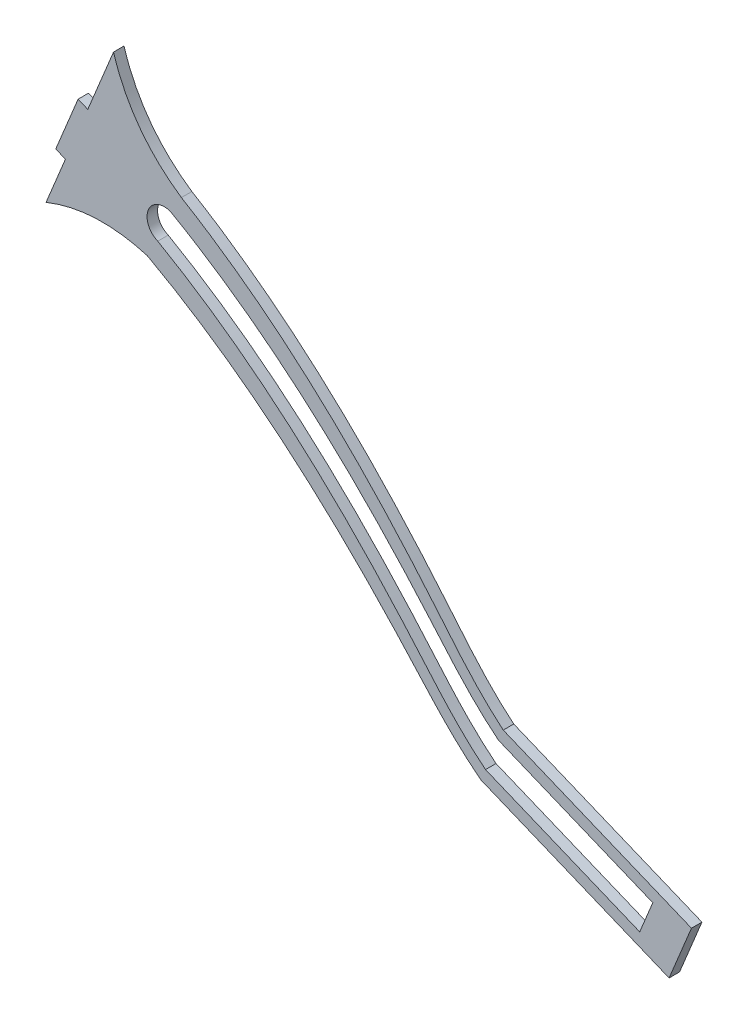
ISO-10303-21;
HEADER;
FILE_DESCRIPTION(('STEP AP214'),'2;1');
FILE_NAME('part.step','',(''),(''),'','','');
FILE_SCHEMA(('AUTOMOTIVE_DESIGN { 1 0 10303 214 1 1 1 1 }'));
ENDSEC;
DATA;
#1=APPLICATION_CONTEXT('core data for automotive mechanical design processes');
#2=APPLICATION_PROTOCOL_DEFINITION('international standard','automotive_design',2000,#1);
#3=PRODUCT_CONTEXT('',#1,'mechanical');
#4=PRODUCT('Part','Part','',(#3));
#5=PRODUCT_RELATED_PRODUCT_CATEGORY('part','',(#4));
#6=PRODUCT_DEFINITION_FORMATION('','',#4);
#7=PRODUCT_DEFINITION_CONTEXT('part definition',#1,'design');
#8=PRODUCT_DEFINITION('design','',#6,#7);
#9=PRODUCT_DEFINITION_SHAPE('','',#8);
#10=(LENGTH_UNIT() NAMED_UNIT(*) SI_UNIT(.MILLI.,.METRE.));
#11=(NAMED_UNIT(*) PLANE_ANGLE_UNIT() SI_UNIT($,.RADIAN.));
#12=(NAMED_UNIT(*) SI_UNIT($,.STERADIAN.) SOLID_ANGLE_UNIT());
#13=UNCERTAINTY_MEASURE_WITH_UNIT(LENGTH_MEASURE(1.E-05),#10,'distance_accuracy_value','');
#14=(GEOMETRIC_REPRESENTATION_CONTEXT(3) GLOBAL_UNCERTAINTY_ASSIGNED_CONTEXT((#13)) GLOBAL_UNIT_ASSIGNED_CONTEXT((#10,
#11,#12)) REPRESENTATION_CONTEXT('',''));
#15=CARTESIAN_POINT('',(0.,0.,0.));
#16=DIRECTION('',(0.,0.,1.));
#17=DIRECTION('',(1.,0.,0.));
#18=AXIS2_PLACEMENT_3D('',#15,#16,#17);
#19=CARTESIAN_POINT('',(72.8165035843439,-45.1124411842966,319.609115736228));
#20=DIRECTION('',(0.924724873269552,-0.380636189499385,0.));
#21=DIRECTION('',(0.380636189499385,0.924724873269552,0.));
#22=AXIS2_PLACEMENT_3D('',#19,#20,#21);
#23=PLANE('',#22);
#24=DIRECTION('',(0.380636189499385,0.924724873269552,0.));
#25=VECTOR('',#24,1.);
#26=CARTESIAN_POINT('',(72.8165035843439,-45.1124411842966,324.609115736228));
#27=LINE('',#26,#25);
#28=CARTESIAN_POINT('',(72.8165035843439,-45.1124411842966,324.609115736228));
#29=VERTEX_POINT('',#28);
#30=CARTESIAN_POINT('',(83.4743168902917,-19.2201447328341,324.609115736228));
#31=VERTEX_POINT('',#30);
#32=EDGE_CURVE('E244',#29,#31,#27,.T.);
#33=ORIENTED_EDGE('',*,*,#32,.F.);
#34=DIRECTION('',(0.,0.,1.));
#35=VECTOR('',#34,1.);
#36=CARTESIAN_POINT('',(72.8165035843439,-45.1124411842966,319.609115736228));
#37=LINE('',#36,#35);
#38=CARTESIAN_POINT('',(72.8165035843439,-45.1124411842966,319.609115736228));
#39=VERTEX_POINT('',#38);
#40=EDGE_CURVE('E11',#39,#29,#37,.T.);
#41=ORIENTED_EDGE('',*,*,#40,.F.);
#42=DIRECTION('',(0.380636189499385,0.924724873269552,0.));
#43=VECTOR('',#42,1.);
#44=CARTESIAN_POINT('',(72.8165035843439,-45.1124411842966,319.609115736228));
#45=LINE('',#44,#43);
#46=CARTESIAN_POINT('',(83.4743168902917,-19.2201447328341,319.609115736228));
#47=VERTEX_POINT('',#46);
#48=EDGE_CURVE('E300',#39,#47,#45,.T.);
#49=ORIENTED_EDGE('',*,*,#48,.T.);
#50=DIRECTION('',(0.,0.,1.));
#51=VECTOR('',#50,1.);
#52=CARTESIAN_POINT('',(83.4743168902917,-19.2201447328341,319.609115736228));
#53=LINE('',#52,#51);
#54=EDGE_CURVE('E40',#47,#31,#53,.T.);
#55=ORIENTED_EDGE('',*,*,#54,.T.);
#56=EDGE_LOOP('',(#33,#41,#49,#55));
#57=FACE_BOUND('',#56,.T.);
#58=ADVANCED_FACE('F37',(#57),#23,.T.);
#59=CARTESIAN_POINT('',(-16.9001284398286,-8.18319018701635,319.609115736228));
#60=DIRECTION('',(-0.380636189499384,-0.924724873269552,0.));
#61=DIRECTION('',(0.924724873269552,-0.380636189499384,0.));
#62=AXIS2_PLACEMENT_3D('',#59,#60,#61);
#63=PLANE('',#62);
#64=DIRECTION('',(0.924724873269552,-0.380636189499384,0.));
#65=VECTOR('',#64,1.);
#66=CARTESIAN_POINT('',(-16.9001284398286,-8.18319018701635,324.609115736228));
#67=LINE('',#66,#65);
#68=CARTESIAN_POINT('',(-16.9001284398286,-8.18319018701635,324.609115736228));
#69=VERTEX_POINT('',#68);
#70=EDGE_CURVE('E295',#69,#29,#67,.T.);
#71=ORIENTED_EDGE('',*,*,#70,.F.);
#72=DIRECTION('',(0.,0.,1.));
#73=VECTOR('',#72,1.);
#74=CARTESIAN_POINT('',(-16.9001284398286,-8.18319018701635,319.609115736228));
#75=LINE('',#74,#73);
#76=CARTESIAN_POINT('',(-16.9001284398286,-8.18319018701635,319.609115736228));
#77=VERTEX_POINT('',#76);
#78=EDGE_CURVE('E45',#77,#69,#75,.T.);
#79=ORIENTED_EDGE('',*,*,#78,.F.);
#80=DIRECTION('',(0.924724873269552,-0.380636189499384,0.));
#81=VECTOR('',#80,1.);
#82=CARTESIAN_POINT('',(-16.9001284398286,-8.18319018701635,319.609115736228));
#83=LINE('',#82,#81);
#84=EDGE_CURVE('E233',#77,#39,#83,.T.);
#85=ORIENTED_EDGE('',*,*,#84,.T.);
#86=ORIENTED_EDGE('',*,*,#40,.T.);
#87=EDGE_LOOP('',(#71,#79,#85,#86));
#88=FACE_BOUND('',#87,.T.);
#89=ADVANCED_FACE('F215',(#88),#63,.T.);
#90=CARTESIAN_POINT('',(-175.911850272844,128.697068334976,319.609115736228));
#91=CARTESIAN_POINT('',(-128.517955825498,102.867060046128,319.609115736228));
#92=CARTESIAN_POINT('',(-75.8520297238891,55.4312582830564,319.609115736228));
#93=CARTESIAN_POINT('',(-30.2221925070742,2.01197393009321,319.609115736228));
#94=CARTESIAN_POINT('',(-16.9001284398227,-8.18319018700178,319.609115736228));
#95=B_SPLINE_CURVE_WITH_KNOTS('',3,(#90,#91,#92,#93,#94),.UNSPECIFIED.,.F.,.F.,(4,1,4),(0.,
0.762851527431731,1.),.UNSPECIFIED.);
#96=DIRECTION('',(0.,0.,1.));
#97=VECTOR('',#96,1.);
#98=SURFACE_OF_LINEAR_EXTRUSION('',#95,#97);
#99=CARTESIAN_POINT('',(-175.911850272844,128.697068334976,324.609115736228));
#100=CARTESIAN_POINT('',(-128.517955825498,102.867060046128,324.609115736228));
#101=CARTESIAN_POINT('',(-75.8520297238891,55.4312582830564,324.609115736228));
#102=CARTESIAN_POINT('',(-30.2221925070742,2.01197393009321,324.609115736228));
#103=CARTESIAN_POINT('',(-16.9001284398227,-8.18319018700178,324.609115736228));
#104=B_SPLINE_CURVE_WITH_KNOTS('',3,(#99,#100,#101,#102,#103),.UNSPECIFIED.,.F.,.F.,(4,1,4),(0.,
0.762851527431731,1.),.UNSPECIFIED.);
#105=CARTESIAN_POINT('',(-175.911850272844,128.697068334976,324.609115736228));
#106=VERTEX_POINT('',#105);
#107=EDGE_CURVE('E287',#106,#69,#104,.T.);
#108=ORIENTED_EDGE('',*,*,#107,.F.);
#109=DIRECTION('',(0.,0.,1.));
#110=VECTOR('',#109,1.);
#111=CARTESIAN_POINT('',(-175.911850272844,128.697068334976,319.609115736228));
#112=LINE('',#111,#110);
#113=CARTESIAN_POINT('',(-175.911850272844,128.697068334976,319.609115736228));
#114=VERTEX_POINT('',#113);
#115=EDGE_CURVE('E303',#114,#106,#112,.T.);
#116=ORIENTED_EDGE('',*,*,#115,.F.);
#117=EDGE_CURVE('E227',#114,#77,#95,.T.);
#118=ORIENTED_EDGE('',*,*,#117,.T.);
#119=ORIENTED_EDGE('',*,*,#78,.T.);
#120=EDGE_LOOP('',(#108,#116,#118,#119));
#121=FACE_BOUND('',#120,.T.);
#122=ADVANCED_FACE('F218',(#121),#98,.T.);
#123=CARTESIAN_POINT('',(-224.182907520058,126.592874832316,319.609115736228));
#124=CARTESIAN_POINT('',(-200.797987468874,136.066038880565,319.609115736228));
#125=CARTESIAN_POINT('',(-175.911850272844,128.697068334976,319.609115736228));
#126=B_SPLINE_CURVE_WITH_KNOTS('',2,(#123,#124,#125),.UNSPECIFIED.,.F.,.F.,(3,3),(0.,1.),.UNSPECIFIED.);
#127=DIRECTION('',(0.,0.,1.));
#128=VECTOR('',#127,1.);
#129=SURFACE_OF_LINEAR_EXTRUSION('',#126,#128);
#130=CARTESIAN_POINT('',(-224.182907520058,126.592874832316,324.609115736228));
#131=CARTESIAN_POINT('',(-200.797987468874,136.066038880565,324.609115736228));
#132=CARTESIAN_POINT('',(-175.911850272844,128.697068334976,324.609115736228));
#133=B_SPLINE_CURVE_WITH_KNOTS('',2,(#130,#131,#132),.UNSPECIFIED.,.F.,.F.,(3,3),(0.,1.),.UNSPECIFIED.);
#134=CARTESIAN_POINT('',(-224.182907520058,126.592874832316,324.609115736228));
#135=VERTEX_POINT('',#134);
#136=EDGE_CURVE('E282',#135,#106,#133,.T.);
#137=ORIENTED_EDGE('',*,*,#136,.F.);
#138=DIRECTION('',(0.,0.,1.));
#139=VECTOR('',#138,1.);
#140=CARTESIAN_POINT('',(-224.182907520058,126.592874832316,319.609115736228));
#141=LINE('',#140,#139);
#142=CARTESIAN_POINT('',(-224.182907520058,126.592874832316,319.609115736228));
#143=VERTEX_POINT('',#142);
#144=EDGE_CURVE('E305',#143,#135,#141,.T.);
#145=ORIENTED_EDGE('',*,*,#144,.F.);
#146=EDGE_CURVE('E234',#143,#114,#126,.T.);
#147=ORIENTED_EDGE('',*,*,#146,.T.);
#148=ORIENTED_EDGE('',*,*,#115,.T.);
#149=EDGE_LOOP('',(#137,#145,#147,#148));
#150=FACE_BOUND('',#149,.T.);
#151=ADVANCED_FACE('F223',(#150),#129,.T.);
#152=CARTESIAN_POINT('',(-224.182907520058,126.592874832316,319.609115736228));
#153=DIRECTION('',(-0.924724873269552,0.380636189499385,0.));
#154=DIRECTION('',(-0.380636189499385,-0.924724873269552,0.));
#155=AXIS2_PLACEMENT_3D('',#152,#153,#154);
#156=PLANE('',#155);
#157=DIRECTION('',(-0.380636189499385,-0.924724873269552,0.));
#158=VECTOR('',#157,1.);
#159=CARTESIAN_POINT('',(-224.182907520058,126.592874832316,324.609115736228));
#160=LINE('',#159,#158);
#161=CARTESIAN_POINT('',(-214.945420062279,149.034604374529,324.609115736228));
#162=VERTEX_POINT('',#161);
#163=EDGE_CURVE('E279',#162,#135,#160,.T.);
#164=ORIENTED_EDGE('',*,*,#163,.F.);
#165=DIRECTION('',(0.,0.,1.));
#166=VECTOR('',#165,1.);
#167=CARTESIAN_POINT('',(-214.945420062279,149.034604374529,319.609115736228));
#168=LINE('',#167,#166);
#169=CARTESIAN_POINT('',(-214.945420062279,149.034604374529,319.609115736228));
#170=VERTEX_POINT('',#169);
#171=EDGE_CURVE('E307',#170,#162,#168,.T.);
#172=ORIENTED_EDGE('',*,*,#171,.F.);
#173=DIRECTION('',(-0.380636189499385,-0.924724873269552,0.));
#174=VECTOR('',#173,1.);
#175=CARTESIAN_POINT('',(-224.182907520058,126.592874832316,319.609115736228));
#176=LINE('',#175,#174);
#177=EDGE_CURVE('E612',#170,#143,#176,.T.);
#178=ORIENTED_EDGE('',*,*,#177,.T.);
#179=ORIENTED_EDGE('',*,*,#144,.T.);
#180=EDGE_LOOP('',(#164,#172,#178,#179));
#181=FACE_BOUND('',#180,.T.);
#182=ADVANCED_FACE('F380',(#181),#156,.T.);
#183=CARTESIAN_POINT('',(-219.569044428627,150.937785322026,319.609115736228));
#184=DIRECTION('',(-0.380636189499384,-0.924724873269552,0.));
#185=DIRECTION('',(0.924724873269552,-0.380636189499384,0.));
#186=AXIS2_PLACEMENT_3D('',#183,#184,#185);
#187=PLANE('',#186);
#188=DIRECTION('',(0.924724873269552,-0.380636189499384,0.));
#189=VECTOR('',#188,1.);
#190=CARTESIAN_POINT('',(-219.569044428627,150.937785322026,324.609115736228));
#191=LINE('',#190,#189);
#192=CARTESIAN_POINT('',(-219.569044428627,150.937785322026,324.609115736228));
#193=VERTEX_POINT('',#192);
#194=EDGE_CURVE('E276',#193,#162,#191,.T.);
#195=ORIENTED_EDGE('',*,*,#194,.F.);
#196=DIRECTION('',(0.,0.,1.));
#197=VECTOR('',#196,1.);
#198=CARTESIAN_POINT('',(-219.569044428627,150.937785322026,319.609115736228));
#199=LINE('',#198,#197);
#200=CARTESIAN_POINT('',(-219.569044428627,150.937785322026,319.609115736228));
#201=VERTEX_POINT('',#200);
#202=EDGE_CURVE('E309',#201,#193,#199,.T.);
#203=ORIENTED_EDGE('',*,*,#202,.F.);
#204=DIRECTION('',(0.924724873269552,-0.380636189499384,0.));
#205=VECTOR('',#204,1.);
#206=CARTESIAN_POINT('',(-219.569044428627,150.937785322026,319.609115736228));
#207=LINE('',#206,#205);
#208=EDGE_CURVE('E610',#201,#170,#207,.T.);
#209=ORIENTED_EDGE('',*,*,#208,.T.);
#210=ORIENTED_EDGE('',*,*,#171,.T.);
#211=EDGE_LOOP('',(#195,#203,#209,#210));
#212=FACE_BOUND('',#211,.T.);
#213=ADVANCED_FACE('F387',(#212),#187,.T.);
#214=CARTESIAN_POINT('',(-219.569044428627,150.937785322026,319.609115736228));
#215=DIRECTION('',(-0.924724873269552,0.380636189499385,0.));
#216=DIRECTION('',(-0.380636189499385,-0.924724873269552,0.));
#217=AXIS2_PLACEMENT_3D('',#214,#215,#216);
#218=PLANE('',#217);
#219=DIRECTION('',(-0.380636189499385,-0.924724873269552,0.));
#220=VECTOR('',#219,1.);
#221=CARTESIAN_POINT('',(-219.569044428627,150.937785322026,324.609115736228));
#222=LINE('',#221,#220);
#223=CARTESIAN_POINT('',(-208.911231122383,176.830081774207,324.609115736228));
#224=VERTEX_POINT('',#223);
#225=EDGE_CURVE('E273',#224,#193,#222,.T.);
#226=ORIENTED_EDGE('',*,*,#225,.F.);
#227=DIRECTION('',(0.,0.,1.));
#228=VECTOR('',#227,1.);
#229=CARTESIAN_POINT('',(-208.911231122383,176.830081774207,319.609115736228));
#230=LINE('',#229,#228);
#231=CARTESIAN_POINT('',(-208.911231122383,176.830081774207,319.609115736228));
#232=VERTEX_POINT('',#231);
#233=EDGE_CURVE('E311',#232,#224,#230,.T.);
#234=ORIENTED_EDGE('',*,*,#233,.F.);
#235=DIRECTION('',(-0.380636189499385,-0.924724873269552,0.));
#236=VECTOR('',#235,1.);
#237=CARTESIAN_POINT('',(-219.569044428627,150.937785322026,319.609115736228));
#238=LINE('',#237,#236);
#239=EDGE_CURVE('E605',#232,#201,#238,.T.);
#240=ORIENTED_EDGE('',*,*,#239,.T.);
#241=ORIENTED_EDGE('',*,*,#202,.T.);
#242=EDGE_LOOP('',(#226,#234,#240,#241));
#243=FACE_BOUND('',#242,.T.);
#244=ADVANCED_FACE('F394',(#243),#218,.T.);
#245=CARTESIAN_POINT('',(-208.911231122383,176.830081774207,319.609115736228));
#246=DIRECTION('',(0.380636189499384,0.924724873269552,0.));
#247=DIRECTION('',(-0.924724873269552,0.380636189499384,0.));
#248=AXIS2_PLACEMENT_3D('',#245,#246,#247);
#249=PLANE('',#248);
#250=DIRECTION('',(-0.924724873269552,0.380636189499384,0.));
#251=VECTOR('',#250,1.);
#252=CARTESIAN_POINT('',(-208.911231122383,176.830081774207,324.609115736228));
#253=LINE('',#252,#251);
#254=CARTESIAN_POINT('',(-204.287606756035,174.92690082671,324.609115736228));
#255=VERTEX_POINT('',#254);
#256=EDGE_CURVE('E270',#255,#224,#253,.T.);
#257=ORIENTED_EDGE('',*,*,#256,.F.);
#258=DIRECTION('',(0.,0.,1.));
#259=VECTOR('',#258,1.);
#260=CARTESIAN_POINT('',(-204.287606756035,174.92690082671,319.609115736228));
#261=LINE('',#260,#259);
#262=CARTESIAN_POINT('',(-204.287606756035,174.92690082671,319.609115736228));
#263=VERTEX_POINT('',#262);
#264=EDGE_CURVE('E313',#263,#255,#261,.T.);
#265=ORIENTED_EDGE('',*,*,#264,.F.);
#266=DIRECTION('',(-0.924724873269552,0.380636189499384,0.));
#267=VECTOR('',#266,1.);
#268=CARTESIAN_POINT('',(-208.911231122383,176.830081774207,319.609115736228));
#269=LINE('',#268,#267);
#270=EDGE_CURVE('E603',#263,#232,#269,.T.);
#271=ORIENTED_EDGE('',*,*,#270,.T.);
#272=ORIENTED_EDGE('',*,*,#233,.T.);
#273=EDGE_LOOP('',(#257,#265,#271,#272));
#274=FACE_BOUND('',#273,.T.);
#275=ADVANCED_FACE('F402',(#274),#249,.T.);
#276=CARTESIAN_POINT('',(-204.287606756035,174.92690082671,319.609115736228));
#277=DIRECTION('',(-0.924724873269552,0.380636189499384,0.));
#278=DIRECTION('',(-0.380636189499384,-0.924724873269552,0.));
#279=AXIS2_PLACEMENT_3D('',#276,#277,#278);
#280=PLANE('',#279);
#281=DIRECTION('',(-0.380636189499384,-0.924724873269552,0.));
#282=VECTOR('',#281,1.);
#283=CARTESIAN_POINT('',(-204.287606756035,174.92690082671,324.609115736228));
#284=LINE('',#283,#282);
#285=CARTESIAN_POINT('',(-192.022205470725,204.724702407469,324.609115736228));
#286=VERTEX_POINT('',#285);
#287=EDGE_CURVE('E264',#286,#255,#284,.T.);
#288=ORIENTED_EDGE('',*,*,#287,.F.);
#289=DIRECTION('',(0.,0.,1.));
#290=VECTOR('',#289,1.);
#291=CARTESIAN_POINT('',(-192.022205470725,204.724702407469,319.609115736228));
#292=LINE('',#291,#290);
#293=CARTESIAN_POINT('',(-192.022205470725,204.724702407469,319.609115736228));
#294=VERTEX_POINT('',#293);
#295=EDGE_CURVE('E315',#294,#286,#292,.T.);
#296=ORIENTED_EDGE('',*,*,#295,.F.);
#297=DIRECTION('',(-0.380636189499384,-0.924724873269552,0.));
#298=VECTOR('',#297,1.);
#299=CARTESIAN_POINT('',(-204.287606756035,174.92690082671,319.609115736228));
#300=LINE('',#299,#298);
#301=EDGE_CURVE('E602',#294,#263,#300,.T.);
#302=ORIENTED_EDGE('',*,*,#301,.T.);
#303=ORIENTED_EDGE('',*,*,#264,.T.);
#304=EDGE_LOOP('',(#288,#296,#302,#303));
#305=FACE_BOUND('',#304,.T.);
#306=ADVANCED_FACE('F410',(#305),#280,.T.);
#307=CARTESIAN_POINT('',(-159.667254414533,160.823469135802,319.609115736228));
#308=CARTESIAN_POINT('',(-183.525718418894,177.076811357464,319.609115736228));
#309=CARTESIAN_POINT('',(-192.022205470725,204.724702407469,319.609115736228));
#310=B_SPLINE_CURVE_WITH_KNOTS('',2,(#307,#308,#309),.UNSPECIFIED.,.F.,.F.,(3,3),(0.,1.),.UNSPECIFIED.);
#311=DIRECTION('',(0.,0.,1.));
#312=VECTOR('',#311,1.);
#313=SURFACE_OF_LINEAR_EXTRUSION('',#310,#312);
#314=CARTESIAN_POINT('',(-159.667254414533,160.823469135802,324.609115736228));
#315=CARTESIAN_POINT('',(-183.525718418894,177.076811357464,324.609115736228));
#316=CARTESIAN_POINT('',(-192.022205470725,204.724702407469,324.609115736228));
#317=B_SPLINE_CURVE_WITH_KNOTS('',2,(#314,#315,#316),.UNSPECIFIED.,.F.,.F.,(3,3),(0.,1.),.UNSPECIFIED.);
#318=CARTESIAN_POINT('',(-159.667254414533,160.823469135802,324.609115736228));
#319=VERTEX_POINT('',#318);
#320=EDGE_CURVE('E256',#319,#286,#317,.T.);
#321=ORIENTED_EDGE('',*,*,#320,.F.);
#322=DIRECTION('',(0.,0.,1.));
#323=VECTOR('',#322,1.);
#324=CARTESIAN_POINT('',(-159.667254414533,160.823469135802,319.609115736228));
#325=LINE('',#324,#323);
#326=CARTESIAN_POINT('',(-159.667254414533,160.823469135802,319.609115736228));
#327=VERTEX_POINT('',#326);
#328=EDGE_CURVE('E317',#327,#319,#325,.T.);
#329=ORIENTED_EDGE('',*,*,#328,.F.);
#330=EDGE_CURVE('E345',#327,#294,#310,.T.);
#331=ORIENTED_EDGE('',*,*,#330,.T.);
#332=ORIENTED_EDGE('',*,*,#295,.T.);
#333=EDGE_LOOP('',(#321,#329,#331,#332));
#334=FACE_BOUND('',#333,.T.);
#335=ADVANCED_FACE('F357',(#334),#313,.T.);
#336=CARTESIAN_POINT('',(-6.24231513388083,17.7091062644463,319.609115736228));
#337=CARTESIAN_POINT('',(-19.1470856782684,28.4275790839837,319.609115736228));
#338=CARTESIAN_POINT('',(-62.6096835936194,83.6245406639863,319.609115736228));
#339=CARTESIAN_POINT('',(-113.341454037557,133.123455083084,319.609115736228));
#340=CARTESIAN_POINT('',(-159.667254414533,160.823469135802,319.609115736228));
#341=B_SPLINE_CURVE_WITH_KNOTS('',3,(#336,#337,#338,#339,#340),.UNSPECIFIED.,.F.,.F.,(4,1,4),
(0.,0.237148472568269,1.),.UNSPECIFIED.);
#342=DIRECTION('',(0.,0.,1.));
#343=VECTOR('',#342,1.);
#344=SURFACE_OF_LINEAR_EXTRUSION('',#341,#343);
#345=CARTESIAN_POINT('',(-6.24231513388083,17.7091062644463,324.609115736228));
#346=CARTESIAN_POINT('',(-19.1470856782684,28.4275790839837,324.609115736228));
#347=CARTESIAN_POINT('',(-62.6096835936194,83.6245406639863,324.609115736228));
#348=CARTESIAN_POINT('',(-113.341454037557,133.123455083084,324.609115736228));
#349=CARTESIAN_POINT('',(-159.667254414533,160.823469135802,324.609115736228));
#350=B_SPLINE_CURVE_WITH_KNOTS('',3,(#345,#346,#347,#348,#349),.UNSPECIFIED.,.F.,.F.,(4,1,4),
(0.,0.237148472568269,1.),.UNSPECIFIED.);
#351=CARTESIAN_POINT('',(-6.24231513388083,17.7091062644463,324.609115736228));
#352=VERTEX_POINT('',#351);
#353=EDGE_CURVE('E251',#352,#319,#350,.T.);
#354=ORIENTED_EDGE('',*,*,#353,.F.);
#355=DIRECTION('',(0.,0.,1.));
#356=VECTOR('',#355,1.);
#357=CARTESIAN_POINT('',(-6.24231513388083,17.7091062644463,319.609115736228));
#358=LINE('',#357,#356);
#359=CARTESIAN_POINT('',(-6.24231513388083,17.7091062644463,319.609115736228));
#360=VERTEX_POINT('',#359);
#361=EDGE_CURVE('E318',#360,#352,#358,.T.);
#362=ORIENTED_EDGE('',*,*,#361,.F.);
#363=EDGE_CURVE('E336',#360,#327,#341,.T.);
#364=ORIENTED_EDGE('',*,*,#363,.T.);
#365=ORIENTED_EDGE('',*,*,#328,.T.);
#366=EDGE_LOOP('',(#354,#362,#364,#365));
#367=FACE_BOUND('',#366,.T.);
#368=ADVANCED_FACE('F354',(#367),#344,.T.);
#369=CARTESIAN_POINT('',(83.4743168902917,-19.2201447328341,319.609115736228));
#370=DIRECTION('',(0.380636189499385,0.924724873269551,0.));
#371=DIRECTION('',(-0.924724873269552,0.380636189499385,0.));
#372=AXIS2_PLACEMENT_3D('',#369,#370,#371);
#373=PLANE('',#372);
#374=DIRECTION('',(-0.924724873269551,0.380636189499385,0.));
#375=VECTOR('',#374,1.);
#376=CARTESIAN_POINT('',(83.4743168902917,-19.2201447328341,324.609115736228));
#377=LINE('',#376,#375);
#378=EDGE_CURVE('E247',#31,#352,#377,.T.);
#379=ORIENTED_EDGE('',*,*,#378,.F.);
#380=ORIENTED_EDGE('',*,*,#54,.F.);
#381=DIRECTION('',(-0.924724873269551,0.380636189499385,0.));
#382=VECTOR('',#381,1.);
#383=CARTESIAN_POINT('',(83.4743168902917,-19.2201447328341,319.609115736228));
#384=LINE('',#383,#382);
#385=EDGE_CURVE('E334',#47,#360,#384,.T.);
#386=ORIENTED_EDGE('',*,*,#385,.T.);
#387=ORIENTED_EDGE('',*,*,#361,.T.);
#388=EDGE_LOOP('',(#379,#380,#386,#387));
#389=FACE_BOUND('',#388,.T.);
#390=ADVANCED_FACE('F211',(#389),#373,.T.);
#391=CARTESIAN_POINT('',(-77.4476509112392,95.2901801398376,319.609115736228));
#392=DIRECTION('',(0.,0.,1.));
#393=DIRECTION('',(1.,0.,0.));
#394=AXIS2_PLACEMENT_3D('',#391,#392,#393);
#395=PLANE('',#394);
#396=DIRECTION('',(0.924724873269552,-0.380636189499384,0.));
#397=VECTOR('',#396,1.);
#398=CARTESIAN_POINT('',(-14.6924385407263,-2.81978592203824,319.609115736228));
#399=LINE('',#398,#397);
#400=CARTESIAN_POINT('',(-14.6924385407263,-2.81978592203824,319.609115736228));
#401=VERTEX_POINT('',#400);
#402=CARTESIAN_POINT('',(58.8073249644412,-33.0738330645096,319.609115736228));
#403=VERTEX_POINT('',#402);
#404=EDGE_CURVE('E170',#401,#403,#399,.T.);
#405=ORIENTED_EDGE('',*,*,#404,.T.);
#406=DIRECTION('',(0.380636189499385,0.924724873269551,0.));
#407=VECTOR('',#406,1.);
#408=CARTESIAN_POINT('',(58.8073249644412,-33.0738330645096,319.609115736228));
#409=LINE('',#408,#407);
#410=CARTESIAN_POINT('',(65.0497584721976,-17.9083451429705,319.609115736228));
#411=VERTEX_POINT('',#410);
#412=EDGE_CURVE('E164',#403,#411,#409,.T.);
#413=ORIENTED_EDGE('',*,*,#412,.T.);
#414=DIRECTION('',(-0.924724873269552,0.380636189499386,0.));
#415=VECTOR('',#414,1.);
#416=CARTESIAN_POINT('',(65.0497584721976,-17.9083451429705,319.609115736228));
#417=LINE('',#416,#415);
#418=CARTESIAN_POINT('',(-8.4500050329698,12.3457019995009,319.609115736228));
#419=VERTEX_POINT('',#418);
#420=EDGE_CURVE('E173',#411,#419,#417,.T.);
#421=ORIENTED_EDGE('',*,*,#420,.T.);
#422=CARTESIAN_POINT('',(-8.45000503296981,12.3457019995009,319.609115736228));
#423=CARTESIAN_POINT('',(-21.566591824105,22.803900378608,319.609115736228));
#424=CARTESIAN_POINT('',(-66.1245810186235,77.1204501967937,319.609115736228));
#425=CARTESIAN_POINT('',(-117.836312175411,125.594689972246,319.609115736228));
#426=CARTESIAN_POINT('',(-164.706918419589,152.362521961188,319.609115736228));
#427=B_SPLINE_CURVE_WITH_KNOTS('',3,(#422,#423,#424,#425,#426),.UNSPECIFIED.,.F.,.F.,(4,1,4),
(0.,0.237148472568269,1.),.UNSPECIFIED.);
#428=CARTESIAN_POINT('',(-164.706918419589,152.362521961188,319.609115736228));
#429=VERTEX_POINT('',#428);
#430=EDGE_CURVE('E53',#419,#429,#427,.T.);
#431=ORIENTED_EDGE('',*,*,#430,.T.);
#432=CARTESIAN_POINT('',(-167.828135173794,144.779778000869,319.609115736228));
#433=DIRECTION('',(0.,0.,1.));
#434=DIRECTION('',(1.,0.,0.));
#435=AXIS2_PLACEMENT_3D('',#432,#433,#434);
#436=CIRCLE('',#435,8.19999999966362);
#437=CARTESIAN_POINT('',(-170.949351926941,137.197034040114,319.609115736228));
#438=VERTEX_POINT('',#437);
#439=EDGE_CURVE('E191',#429,#438,#436,.T.);
#440=ORIENTED_EDGE('',*,*,#439,.T.);
#441=CARTESIAN_POINT('',(-170.949351926941,137.197034040114,319.609115736228));
#442=CARTESIAN_POINT('',(-124.078745682839,110.429202051037,319.609115736228));
#443=CARTESIAN_POINT('',(-72.3670145261891,61.9549622754359,319.609115736228));
#444=CARTESIAN_POINT('',(-27.8090253318257,7.6384124571213,319.609115736228));
#445=CARTESIAN_POINT('',(-14.6924385407202,-2.81978592202363,319.609115736228));
#446=B_SPLINE_CURVE_WITH_KNOTS('',3,(#441,#442,#443,#444,#445),.UNSPECIFIED.,.F.,.F.,(4,1,4),
(0.,0.762851527431731,1.),.UNSPECIFIED.);
#447=EDGE_CURVE('E587',#438,#401,#446,.T.);
#448=ORIENTED_EDGE('',*,*,#447,.T.);
#449=EDGE_LOOP('',(#405,#413,#421,#431,#440,#448));
#450=FACE_BOUND('',#449,.T.);
#451=ORIENTED_EDGE('',*,*,#48,.F.);
#452=ORIENTED_EDGE('',*,*,#84,.F.);
#453=ORIENTED_EDGE('',*,*,#117,.F.);
#454=ORIENTED_EDGE('',*,*,#146,.F.);
#455=ORIENTED_EDGE('',*,*,#177,.F.);
#456=ORIENTED_EDGE('',*,*,#208,.F.);
#457=ORIENTED_EDGE('',*,*,#239,.F.);
#458=ORIENTED_EDGE('',*,*,#270,.F.);
#459=ORIENTED_EDGE('',*,*,#301,.F.);
#460=ORIENTED_EDGE('',*,*,#330,.F.);
#461=ORIENTED_EDGE('',*,*,#363,.F.);
#462=ORIENTED_EDGE('',*,*,#385,.F.);
#463=EDGE_LOOP('',(#451,#452,#453,#454,#455,#456,#457,#458,#459,#460,#461,#462));
#464=FACE_BOUND('',#463,.T.);
#465=ADVANCED_FACE('F177',(#450,#464),#395,.F.);
#466=CARTESIAN_POINT('',(-77.4476509112392,95.2901801398376,324.609115736228));
#467=DIRECTION('',(0.,0.,1.));
#468=DIRECTION('',(1.,0.,0.));
#469=AXIS2_PLACEMENT_3D('',#466,#467,#468);
#470=PLANE('',#469);
#471=DIRECTION('',(0.380636189499385,0.924724873269551,0.));
#472=VECTOR('',#471,1.);
#473=CARTESIAN_POINT('',(58.8073249644412,-33.0738330645096,324.609115736228));
#474=LINE('',#473,#472);
#475=CARTESIAN_POINT('',(58.8073249644412,-33.0738330645096,324.609115736228));
#476=VERTEX_POINT('',#475);
#477=CARTESIAN_POINT('',(65.0497584721976,-17.9083451429705,324.609115736228));
#478=VERTEX_POINT('',#477);
#479=EDGE_CURVE('E61',#476,#478,#474,.T.);
#480=ORIENTED_EDGE('',*,*,#479,.F.);
#481=DIRECTION('',(0.924724873269552,-0.380636189499384,0.));
#482=VECTOR('',#481,1.);
#483=CARTESIAN_POINT('',(-14.6924385407263,-2.81978592203824,324.609115736228));
#484=LINE('',#483,#482);
#485=CARTESIAN_POINT('',(-14.6924385407263,-2.81978592203824,324.609115736228));
#486=VERTEX_POINT('',#485);
#487=EDGE_CURVE('E181',#486,#476,#484,.T.);
#488=ORIENTED_EDGE('',*,*,#487,.F.);
#489=CARTESIAN_POINT('',(-170.949351926941,137.197034040114,324.609115736228));
#490=CARTESIAN_POINT('',(-124.078745682839,110.429202051037,324.609115736228));
#491=CARTESIAN_POINT('',(-72.3670145261891,61.9549622754359,324.609115736228));
#492=CARTESIAN_POINT('',(-27.8090253318257,7.6384124571213,324.609115736228));
#493=CARTESIAN_POINT('',(-14.6924385407202,-2.81978592202363,324.609115736228));
#494=B_SPLINE_CURVE_WITH_KNOTS('',3,(#489,#490,#491,#492,#493),.UNSPECIFIED.,.F.,.F.,(4,1,4),
(0.,0.762851527431731,1.),.UNSPECIFIED.);
#495=CARTESIAN_POINT('',(-170.949351926941,137.197034040114,324.609115736228));
#496=VERTEX_POINT('',#495);
#497=EDGE_CURVE('E184',#496,#486,#494,.T.);
#498=ORIENTED_EDGE('',*,*,#497,.F.);
#499=CARTESIAN_POINT('',(-167.828135173794,144.779778000869,324.609115736228));
#500=DIRECTION('',(0.,0.,1.));
#501=DIRECTION('',(1.,0.,0.));
#502=AXIS2_PLACEMENT_3D('',#499,#500,#501);
#503=CIRCLE('',#502,8.19999999966362);
#504=CARTESIAN_POINT('',(-164.706918419589,152.362521961188,324.609115736228));
#505=VERTEX_POINT('',#504);
#506=EDGE_CURVE('E554',#505,#496,#503,.T.);
#507=ORIENTED_EDGE('',*,*,#506,.F.);
#508=CARTESIAN_POINT('',(-8.45000503296981,12.3457019995009,324.609115736228));
#509=CARTESIAN_POINT('',(-21.566591824105,22.803900378608,324.609115736228));
#510=CARTESIAN_POINT('',(-66.1245810186235,77.1204501967937,324.609115736228));
#511=CARTESIAN_POINT('',(-117.836312175411,125.594689972246,324.609115736228));
#512=CARTESIAN_POINT('',(-164.706918419589,152.362521961188,324.609115736228));
#513=B_SPLINE_CURVE_WITH_KNOTS('',3,(#508,#509,#510,#511,#512),.UNSPECIFIED.,.F.,.F.,(4,1,4),
(0.,0.237148472568269,1.),.UNSPECIFIED.);
#514=CARTESIAN_POINT('',(-8.45000503296981,12.3457019995009,324.609115736228));
#515=VERTEX_POINT('',#514);
#516=EDGE_CURVE('E562',#515,#505,#513,.T.);
#517=ORIENTED_EDGE('',*,*,#516,.F.);
#518=DIRECTION('',(-0.924724873269552,0.380636189499386,0.));
#519=VECTOR('',#518,1.);
#520=CARTESIAN_POINT('',(65.0497584721976,-17.9083451429705,324.609115736228));
#521=LINE('',#520,#519);
#522=EDGE_CURVE('E578',#478,#515,#521,.T.);
#523=ORIENTED_EDGE('',*,*,#522,.F.);
#524=EDGE_LOOP('',(#480,#488,#498,#507,#517,#523));
#525=FACE_BOUND('',#524,.T.);
#526=ORIENTED_EDGE('',*,*,#32,.T.);
#527=ORIENTED_EDGE('',*,*,#378,.T.);
#528=ORIENTED_EDGE('',*,*,#353,.T.);
#529=ORIENTED_EDGE('',*,*,#320,.T.);
#530=ORIENTED_EDGE('',*,*,#287,.T.);
#531=ORIENTED_EDGE('',*,*,#256,.T.);
#532=ORIENTED_EDGE('',*,*,#225,.T.);
#533=ORIENTED_EDGE('',*,*,#194,.T.);
#534=ORIENTED_EDGE('',*,*,#163,.T.);
#535=ORIENTED_EDGE('',*,*,#136,.T.);
#536=ORIENTED_EDGE('',*,*,#107,.T.);
#537=ORIENTED_EDGE('',*,*,#70,.T.);
#538=EDGE_LOOP('',(#526,#527,#528,#529,#530,#531,#532,#533,#534,#535,#536,#537));
#539=FACE_BOUND('',#538,.T.);
#540=ADVANCED_FACE('F208',(#525,#539),#470,.T.);
#541=CARTESIAN_POINT('',(58.8073249644412,-33.0738330645096,319.609115736228));
#542=DIRECTION('',(0.924724873269552,-0.380636189499385,0.));
#543=DIRECTION('',(0.380636189499385,0.924724873269552,0.));
#544=AXIS2_PLACEMENT_3D('',#541,#542,#543);
#545=PLANE('',#544);
#546=ORIENTED_EDGE('',*,*,#479,.T.);
#547=DIRECTION('',(0.,0.,1.));
#548=VECTOR('',#547,1.);
#549=CARTESIAN_POINT('',(65.0497584721976,-17.9083451429705,319.609115736228));
#550=LINE('',#549,#548);
#551=EDGE_CURVE('E160',#411,#478,#550,.T.);
#552=ORIENTED_EDGE('',*,*,#551,.F.);
#553=ORIENTED_EDGE('',*,*,#412,.F.);
#554=DIRECTION('',(0.,0.,1.));
#555=VECTOR('',#554,1.);
#556=CARTESIAN_POINT('',(58.8073249644412,-33.0738330645096,319.609115736228));
#557=LINE('',#556,#555);
#558=EDGE_CURVE('E248',#403,#476,#557,.T.);
#559=ORIENTED_EDGE('',*,*,#558,.T.);
#560=EDGE_LOOP('',(#546,#552,#553,#559));
#561=FACE_BOUND('',#560,.T.);
#562=ADVANCED_FACE('F162',(#561),#545,.F.);
#563=CARTESIAN_POINT('',(-14.6924385407263,-2.81978592203824,319.609115736228));
#564=DIRECTION('',(-0.380636189499384,-0.924724873269552,0.));
#565=DIRECTION('',(0.924724873269552,-0.380636189499384,0.));
#566=AXIS2_PLACEMENT_3D('',#563,#564,#565);
#567=PLANE('',#566);
#568=ORIENTED_EDGE('',*,*,#487,.T.);
#569=ORIENTED_EDGE('',*,*,#558,.F.);
#570=ORIENTED_EDGE('',*,*,#404,.F.);
#571=DIRECTION('',(0.,0.,1.));
#572=VECTOR('',#571,1.);
#573=CARTESIAN_POINT('',(-14.6924385407263,-2.81978592203824,319.609115736228));
#574=LINE('',#573,#572);
#575=EDGE_CURVE('E575',#401,#486,#574,.T.);
#576=ORIENTED_EDGE('',*,*,#575,.T.);
#577=EDGE_LOOP('',(#568,#569,#570,#576));
#578=FACE_BOUND('',#577,.T.);
#579=ADVANCED_FACE('F207',(#578),#567,.F.);
#580=DIRECTION('',(0.,0.,1.));
#581=VECTOR('',#580,1.);
#582=SURFACE_OF_LINEAR_EXTRUSION('',#446,#581);
#583=ORIENTED_EDGE('',*,*,#497,.T.);
#584=ORIENTED_EDGE('',*,*,#575,.F.);
#585=ORIENTED_EDGE('',*,*,#447,.F.);
#586=DIRECTION('',(0.,0.,1.));
#587=VECTOR('',#586,1.);
#588=CARTESIAN_POINT('',(-170.949351926941,137.197034040114,319.609115736228));
#589=LINE('',#588,#587);
#590=EDGE_CURVE('E557',#438,#496,#589,.T.);
#591=ORIENTED_EDGE('',*,*,#590,.T.);
#592=EDGE_LOOP('',(#583,#584,#585,#591));
#593=FACE_BOUND('',#592,.T.);
#594=ADVANCED_FACE('F464',(#593),#582,.F.);
#595=CARTESIAN_POINT('',(-167.828135173794,144.779778000869,319.609115736228));
#596=DIRECTION('',(0.,0.,1.));
#597=DIRECTION('',(1.,0.,0.));
#598=AXIS2_PLACEMENT_3D('',#595,#596,#597);
#599=CYLINDRICAL_SURFACE('',#598,8.19999999966362);
#600=ORIENTED_EDGE('',*,*,#506,.T.);
#601=ORIENTED_EDGE('',*,*,#590,.F.);
#602=ORIENTED_EDGE('',*,*,#439,.F.);
#603=DIRECTION('',(0.,0.,1.));
#604=VECTOR('',#603,1.);
#605=CARTESIAN_POINT('',(-164.706918419589,152.362521961188,319.609115736228));
#606=LINE('',#605,#604);
#607=EDGE_CURVE('E559',#429,#505,#606,.T.);
#608=ORIENTED_EDGE('',*,*,#607,.T.);
#609=EDGE_LOOP('',(#600,#601,#602,#608));
#610=FACE_BOUND('',#609,.T.);
#611=ADVANCED_FACE('F201',(#610),#599,.F.);
#612=DIRECTION('',(0.,0.,1.));
#613=VECTOR('',#612,1.);
#614=SURFACE_OF_LINEAR_EXTRUSION('',#427,#613);
#615=ORIENTED_EDGE('',*,*,#516,.T.);
#616=ORIENTED_EDGE('',*,*,#607,.F.);
#617=ORIENTED_EDGE('',*,*,#430,.F.);
#618=DIRECTION('',(0.,0.,1.));
#619=VECTOR('',#618,1.);
#620=CARTESIAN_POINT('',(-8.45000503296981,12.3457019995009,319.609115736228));
#621=LINE('',#620,#619);
#622=EDGE_CURVE('E169',#419,#515,#621,.T.);
#623=ORIENTED_EDGE('',*,*,#622,.T.);
#624=EDGE_LOOP('',(#615,#616,#617,#623));
#625=FACE_BOUND('',#624,.T.);
#626=ADVANCED_FACE('F197',(#625),#614,.F.);
#627=CARTESIAN_POINT('',(65.0497584721976,-17.9083451429705,319.609115736228));
#628=DIRECTION('',(0.380636189499386,0.924724873269551,0.));
#629=DIRECTION('',(-0.924724873269551,0.380636189499386,0.));
#630=AXIS2_PLACEMENT_3D('',#627,#628,#629);
#631=PLANE('',#630);
#632=ORIENTED_EDGE('',*,*,#522,.T.);
#633=ORIENTED_EDGE('',*,*,#622,.F.);
#634=ORIENTED_EDGE('',*,*,#420,.F.);
#635=ORIENTED_EDGE('',*,*,#551,.T.);
#636=EDGE_LOOP('',(#632,#633,#634,#635));
#637=FACE_BOUND('',#636,.T.);
#638=ADVANCED_FACE('F174',(#637),#631,.F.);
#639=CLOSED_SHELL('',(#58,#89,#122,#151,#182,#213,#244,#275,#306,#335,#368,#390,#465,#540,#562,
#579,#594,#611,#626,#638));
#640=MANIFOLD_SOLID_BREP('B2',#639);
#641=ADVANCED_BREP_SHAPE_REPRESENTATION('',(#18,#640),#14);
#642=SHAPE_DEFINITION_REPRESENTATION(#9,#641);
ENDSEC;
END-ISO-10303-21;
